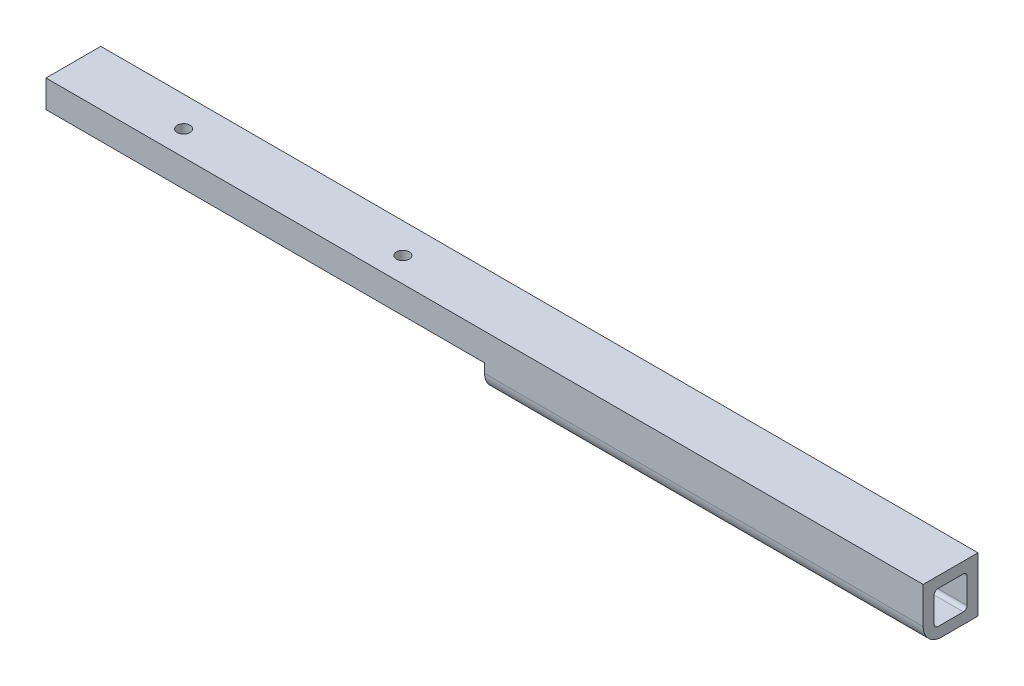
ISO-10303-21;
HEADER;
FILE_DESCRIPTION(('STEP AP214'),'2;1');
FILE_NAME('part.step','',(''),(''),'','','');
FILE_SCHEMA(('AUTOMOTIVE_DESIGN { 1 0 10303 214 1 1 1 1 }'));
ENDSEC;
DATA;
#1=APPLICATION_CONTEXT('core data for automotive mechanical design processes');
#2=APPLICATION_PROTOCOL_DEFINITION('international standard','automotive_design',2000,#1);
#3=PRODUCT_CONTEXT('',#1,'mechanical');
#4=PRODUCT('Part','Part','',(#3));
#5=PRODUCT_RELATED_PRODUCT_CATEGORY('part','',(#4));
#6=PRODUCT_DEFINITION_FORMATION('','',#4);
#7=PRODUCT_DEFINITION_CONTEXT('part definition',#1,'design');
#8=PRODUCT_DEFINITION('design','',#6,#7);
#9=PRODUCT_DEFINITION_SHAPE('','',#8);
#10=(LENGTH_UNIT() NAMED_UNIT(*) SI_UNIT(.MILLI.,.METRE.));
#11=(NAMED_UNIT(*) PLANE_ANGLE_UNIT() SI_UNIT($,.RADIAN.));
#12=(NAMED_UNIT(*) SI_UNIT($,.STERADIAN.) SOLID_ANGLE_UNIT());
#13=UNCERTAINTY_MEASURE_WITH_UNIT(LENGTH_MEASURE(1.E-05),#10,'distance_accuracy_value','');
#14=(GEOMETRIC_REPRESENTATION_CONTEXT(3) GLOBAL_UNCERTAINTY_ASSIGNED_CONTEXT((#13)) GLOBAL_UNIT_ASSIGNED_CONTEXT((#10,
#11,#12)) REPRESENTATION_CONTEXT('',''));
#15=CARTESIAN_POINT('',(0.,0.,0.));
#16=DIRECTION('',(0.,0.,1.));
#17=DIRECTION('',(1.,0.,0.));
#18=AXIS2_PLACEMENT_3D('',#15,#16,#17);
#19=CARTESIAN_POINT('',(225.,-320.691488077077,22.39));
#20=DIRECTION('',(-1.,0.,0.));
#21=DIRECTION('',(0.,0.,1.));
#22=AXIS2_PLACEMENT_3D('',#19,#20,#21);
#23=PLANE('',#22);
#24=DIRECTION('',(0.,0.,1.));
#25=VECTOR('',#24,1.);
#26=CARTESIAN_POINT('',(225.,-320.691488077077,22.39));
#27=LINE('',#26,#25);
#28=CARTESIAN_POINT('',(225.,-320.691488077077,22.4));
#29=VERTEX_POINT('',#28);
#30=CARTESIAN_POINT('',(225.,-320.691488077077,37.4));
#31=VERTEX_POINT('',#30);
#32=EDGE_CURVE('E11',#29,#31,#27,.T.);
#33=ORIENTED_EDGE('',*,*,#32,.F.);
#34=DIRECTION('',(0.,-1.,0.));
#35=VECTOR('',#34,1.);
#36=CARTESIAN_POINT('',(225.,-313.191488077077,22.4));
#37=LINE('',#36,#35);
#38=CARTESIAN_POINT('',(225.,-328.191488077078,22.4));
#39=VERTEX_POINT('',#38);
#40=EDGE_CURVE('E221',#29,#39,#37,.T.);
#41=ORIENTED_EDGE('',*,*,#40,.T.);
#42=DIRECTION('',(0.,0.,1.));
#43=VECTOR('',#42,1.);
#44=CARTESIAN_POINT('',(225.,-328.191488077078,22.4));
#45=LINE('',#44,#43);
#46=CARTESIAN_POINT('',(225.,-328.191488077077,32.4));
#47=VERTEX_POINT('',#46);
#48=EDGE_CURVE('E193',#39,#47,#45,.T.);
#49=ORIENTED_EDGE('',*,*,#48,.T.);
#50=CARTESIAN_POINT('',(225.,-323.191488077077,32.4));
#51=DIRECTION('',(-1.,0.,0.));
#52=DIRECTION('',(0.,0.,1.));
#53=AXIS2_PLACEMENT_3D('',#50,#51,#52);
#54=CIRCLE('',#53,5.);
#55=CARTESIAN_POINT('',(225.,-323.191488077077,37.4));
#56=VERTEX_POINT('',#55);
#57=EDGE_CURVE('E188',#56,#47,#54,.F.);
#58=ORIENTED_EDGE('',*,*,#57,.F.);
#59=DIRECTION('',(0.,1.,0.));
#60=VECTOR('',#59,1.);
#61=CARTESIAN_POINT('',(225.,-313.191488077077,37.4));
#62=LINE('',#61,#60);
#63=EDGE_CURVE('E205',#56,#31,#62,.T.);
#64=ORIENTED_EDGE('',*,*,#63,.T.);
#65=EDGE_LOOP('',(#33,#41,#49,#58,#64));
#66=FACE_BOUND('',#65,.T.);
#67=ADVANCED_FACE('F37',(#66),#23,.T.);
#68=CARTESIAN_POINT('',(105.,-320.691488077077,22.39));
#69=DIRECTION('',(0.,-1.,0.));
#70=DIRECTION('',(0.,0.,-1.));
#71=AXIS2_PLACEMENT_3D('',#68,#69,#70);
#72=PLANE('',#71);
#73=CARTESIAN_POINT('',(195.886266753297,-320.691488077077,30.6295855642618));
#74=DIRECTION('',(0.,-1.,0.));
#75=DIRECTION('',(0.,0.,-1.));
#76=AXIS2_PLACEMENT_3D('',#73,#74,#75);
#77=CIRCLE('',#76,1.75000000000001);
#78=CARTESIAN_POINT('',(195.886266753297,-320.691488077077,28.8795855642618));
#79=VERTEX_POINT('',#78);
#80=EDGE_CURVE('E250',#79,#79,#77,.T.);
#81=ORIENTED_EDGE('',*,*,#80,.F.);
#82=EDGE_LOOP('',(#81));
#83=FACE_BOUND('',#82,.T.);
#84=CARTESIAN_POINT('',(135.886266753297,-320.691488077077,30.6295855642618));
#85=DIRECTION('',(0.,-1.,0.));
#86=DIRECTION('',(0.,0.,-1.));
#87=AXIS2_PLACEMENT_3D('',#84,#85,#86);
#88=CIRCLE('',#87,1.75000000000001);
#89=CARTESIAN_POINT('',(135.886266753297,-320.691488077077,28.8795855642618));
#90=VERTEX_POINT('',#89);
#91=EDGE_CURVE('E225',#90,#90,#88,.T.);
#92=ORIENTED_EDGE('',*,*,#91,.F.);
#93=EDGE_LOOP('',(#92));
#94=FACE_BOUND('',#93,.T.);
#95=DIRECTION('',(0.,0.,1.));
#96=VECTOR('',#95,1.);
#97=CARTESIAN_POINT('',(105.,-320.691488077077,22.39));
#98=LINE('',#97,#96);
#99=CARTESIAN_POINT('',(105.,-320.691488077077,22.4));
#100=VERTEX_POINT('',#99);
#101=CARTESIAN_POINT('',(105.,-320.691488077077,37.4));
#102=VERTEX_POINT('',#101);
#103=EDGE_CURVE('E48',#100,#102,#98,.T.);
#104=ORIENTED_EDGE('',*,*,#103,.F.);
#105=DIRECTION('',(1.,0.,0.));
#106=VECTOR('',#105,1.);
#107=CARTESIAN_POINT('',(366.213203435596,-320.691488077077,22.4));
#108=LINE('',#107,#106);
#109=EDGE_CURVE('E217',#100,#29,#108,.T.);
#110=ORIENTED_EDGE('',*,*,#109,.T.);
#111=ORIENTED_EDGE('',*,*,#32,.T.);
#112=DIRECTION('',(-1.,0.,0.));
#113=VECTOR('',#112,1.);
#114=CARTESIAN_POINT('',(366.213203435596,-320.691488077077,37.4));
#115=LINE('',#114,#113);
#116=EDGE_CURVE('E201',#31,#102,#115,.T.);
#117=ORIENTED_EDGE('',*,*,#116,.T.);
#118=EDGE_LOOP('',(#104,#110,#111,#117));
#119=FACE_BOUND('',#118,.T.);
#120=ADVANCED_FACE('F334',(#83,#94,#119),#72,.T.);
#121=CARTESIAN_POINT('',(105.,-313.191488077077,22.39));
#122=DIRECTION('',(-1.,0.,0.));
#123=DIRECTION('',(0.,-1.,0.));
#124=AXIS2_PLACEMENT_3D('',#121,#122,#123);
#125=PLANE('',#124);
#126=DIRECTION('',(0.,0.,-1.));
#127=VECTOR('',#126,1.);
#128=CARTESIAN_POINT('',(105.,-313.191488077077,22.4));
#129=LINE('',#128,#127);
#130=CARTESIAN_POINT('',(105.,-313.191488077077,37.4));
#131=VERTEX_POINT('',#130);
#132=CARTESIAN_POINT('',(105.,-313.191488077077,22.4));
#133=VERTEX_POINT('',#132);
#134=EDGE_CURVE('E209',#131,#133,#129,.T.);
#135=ORIENTED_EDGE('',*,*,#134,.T.);
#136=DIRECTION('',(0.,-1.,0.));
#137=VECTOR('',#136,1.);
#138=CARTESIAN_POINT('',(105.,-313.191488077078,22.4));
#139=LINE('',#138,#137);
#140=EDGE_CURVE('E213',#133,#100,#139,.T.);
#141=ORIENTED_EDGE('',*,*,#140,.T.);
#142=ORIENTED_EDGE('',*,*,#103,.T.);
#143=DIRECTION('',(0.,1.,0.));
#144=VECTOR('',#143,1.);
#145=CARTESIAN_POINT('',(105.,-313.191488077078,37.4));
#146=LINE('',#145,#144);
#147=EDGE_CURVE('E197',#102,#131,#146,.T.);
#148=ORIENTED_EDGE('',*,*,#147,.T.);
#149=EDGE_LOOP('',(#135,#141,#142,#148));
#150=FACE_BOUND('',#149,.T.);
#151=ADVANCED_FACE('F327',(#150),#125,.T.);
#152=CARTESIAN_POINT('',(335.,-324.191488077078,26.4));
#153=DIRECTION('',(1.,0.,0.));
#154=DIRECTION('',(0.,0.,-1.));
#155=AXIS2_PLACEMENT_3D('',#152,#153,#154);
#156=PLANE('',#155);
#157=CARTESIAN_POINT('',(335.,-324.191488077078,26.4));
#158=DIRECTION('',(1.,0.,0.));
#159=DIRECTION('',(0.,0.,-1.));
#160=AXIS2_PLACEMENT_3D('',#157,#158,#159);
#161=CIRCLE('',#160,1.);
#162=CARTESIAN_POINT('',(335.,-325.191488077078,26.4));
#163=VERTEX_POINT('',#162);
#164=CARTESIAN_POINT('',(335.,-324.191488077078,25.4));
#165=VERTEX_POINT('',#164);
#166=EDGE_CURVE('E180',#163,#165,#161,.T.);
#167=ORIENTED_EDGE('',*,*,#166,.T.);
#168=DIRECTION('',(0.,1.,0.));
#169=VECTOR('',#168,1.);
#170=CARTESIAN_POINT('',(335.,-324.191488077078,25.4));
#171=LINE('',#170,#169);
#172=CARTESIAN_POINT('',(335.,-317.191488077077,25.4));
#173=VERTEX_POINT('',#172);
#174=EDGE_CURVE('E176',#165,#173,#171,.T.);
#175=ORIENTED_EDGE('',*,*,#174,.T.);
#176=CARTESIAN_POINT('',(335.,-317.191488077077,26.4));
#177=DIRECTION('',(1.,0.,0.));
#178=DIRECTION('',(0.,0.,-1.));
#179=AXIS2_PLACEMENT_3D('',#176,#177,#178);
#180=CIRCLE('',#179,1.);
#181=CARTESIAN_POINT('',(335.,-316.191488077077,26.4));
#182=VERTEX_POINT('',#181);
#183=EDGE_CURVE('E172',#173,#182,#180,.T.);
#184=ORIENTED_EDGE('',*,*,#183,.T.);
#185=DIRECTION('',(0.,0.,1.));
#186=VECTOR('',#185,1.);
#187=CARTESIAN_POINT('',(335.,-316.191488077077,26.4));
#188=LINE('',#187,#186);
#189=CARTESIAN_POINT('',(335.,-316.191488077077,33.4));
#190=VERTEX_POINT('',#189);
#191=EDGE_CURVE('E169',#182,#190,#188,.T.);
#192=ORIENTED_EDGE('',*,*,#191,.T.);
#193=CARTESIAN_POINT('',(335.,-317.191488077077,33.4));
#194=DIRECTION('',(1.,0.,0.));
#195=DIRECTION('',(0.,0.,1.));
#196=AXIS2_PLACEMENT_3D('',#193,#194,#195);
#197=CIRCLE('',#196,1.);
#198=CARTESIAN_POINT('',(335.,-317.191488077077,34.4));
#199=VERTEX_POINT('',#198);
#200=EDGE_CURVE('E119',#190,#199,#197,.T.);
#201=ORIENTED_EDGE('',*,*,#200,.T.);
#202=DIRECTION('',(0.,-1.,0.));
#203=VECTOR('',#202,1.);
#204=CARTESIAN_POINT('',(335.,-317.191488077077,34.4));
#205=LINE('',#204,#203);
#206=CARTESIAN_POINT('',(335.,-324.191488077077,34.4));
#207=VERTEX_POINT('',#206);
#208=EDGE_CURVE('E164',#199,#207,#205,.T.);
#209=ORIENTED_EDGE('',*,*,#208,.T.);
#210=CARTESIAN_POINT('',(335.,-324.191488077077,33.4));
#211=DIRECTION('',(1.,0.,0.));
#212=DIRECTION('',(0.,0.,-1.));
#213=AXIS2_PLACEMENT_3D('',#210,#211,#212);
#214=CIRCLE('',#213,1.);
#215=CARTESIAN_POINT('',(335.,-325.191488077077,33.4));
#216=VERTEX_POINT('',#215);
#217=EDGE_CURVE('E160',#207,#216,#214,.T.);
#218=ORIENTED_EDGE('',*,*,#217,.T.);
#219=DIRECTION('',(0.,0.,-1.));
#220=VECTOR('',#219,1.);
#221=CARTESIAN_POINT('',(335.,-325.191488077077,33.4));
#222=LINE('',#221,#220);
#223=EDGE_CURVE('E157',#216,#163,#222,.T.);
#224=ORIENTED_EDGE('',*,*,#223,.T.);
#225=EDGE_LOOP('',(#167,#175,#184,#192,#201,#209,#218,#224));
#226=FACE_BOUND('',#225,.T.);
#227=ADVANCED_FACE('F313',(#226),#156,.T.);
#228=CARTESIAN_POINT('',(335.,-317.191488077077,26.4));
#229=DIRECTION('',(1.,0.,0.));
#230=DIRECTION('',(0.,0.,-1.));
#231=AXIS2_PLACEMENT_3D('',#228,#229,#230);
#232=CYLINDRICAL_SURFACE('',#231,1.);
#233=CARTESIAN_POINT('',(345.,-317.191488077077,26.4));
#234=DIRECTION('',(1.,0.,0.));
#235=DIRECTION('',(0.,0.,-1.));
#236=AXIS2_PLACEMENT_3D('',#233,#234,#235);
#237=CIRCLE('',#236,1.);
#238=CARTESIAN_POINT('',(345.,-317.191488077077,25.4));
#239=VERTEX_POINT('',#238);
#240=CARTESIAN_POINT('',(345.,-316.191488077077,26.4));
#241=VERTEX_POINT('',#240);
#242=EDGE_CURVE('E133',#239,#241,#237,.T.);
#243=ORIENTED_EDGE('',*,*,#242,.T.);
#244=DIRECTION('',(1.,0.,0.));
#245=VECTOR('',#244,1.);
#246=CARTESIAN_POINT('',(335.,-316.191488077077,26.4));
#247=LINE('',#246,#245);
#248=EDGE_CURVE('E124',#182,#241,#247,.T.);
#249=ORIENTED_EDGE('',*,*,#248,.F.);
#250=ORIENTED_EDGE('',*,*,#183,.F.);
#251=DIRECTION('',(1.,0.,0.));
#252=VECTOR('',#251,1.);
#253=CARTESIAN_POINT('',(335.,-317.191488077077,25.4));
#254=LINE('',#253,#252);
#255=EDGE_CURVE('E57',#173,#239,#254,.T.);
#256=ORIENTED_EDGE('',*,*,#255,.T.);
#257=EDGE_LOOP('',(#243,#249,#250,#256));
#258=FACE_BOUND('',#257,.T.);
#259=ADVANCED_FACE('F326',(#258),#232,.F.);
#260=CARTESIAN_POINT('',(335.,-316.191488077077,26.4));
#261=DIRECTION('',(0.,1.,0.));
#262=DIRECTION('',(0.,0.,1.));
#263=AXIS2_PLACEMENT_3D('',#260,#261,#262);
#264=PLANE('',#263);
#265=DIRECTION('',(0.,0.,1.));
#266=VECTOR('',#265,1.);
#267=CARTESIAN_POINT('',(345.,-316.191488077077,26.4));
#268=LINE('',#267,#266);
#269=CARTESIAN_POINT('',(345.,-316.191488077077,33.4));
#270=VERTEX_POINT('',#269);
#271=EDGE_CURVE('E128',#241,#270,#268,.T.);
#272=ORIENTED_EDGE('',*,*,#271,.T.);
#273=DIRECTION('',(1.,0.,0.));
#274=VECTOR('',#273,1.);
#275=CARTESIAN_POINT('',(335.,-316.191488077077,33.4));
#276=LINE('',#275,#274);
#277=EDGE_CURVE('E112',#190,#270,#276,.T.);
#278=ORIENTED_EDGE('',*,*,#277,.F.);
#279=ORIENTED_EDGE('',*,*,#191,.F.);
#280=ORIENTED_EDGE('',*,*,#248,.T.);
#281=EDGE_LOOP('',(#272,#278,#279,#280));
#282=FACE_BOUND('',#281,.T.);
#283=ADVANCED_FACE('F129',(#282),#264,.F.);
#284=CARTESIAN_POINT('',(335.,-317.191488077077,33.4));
#285=DIRECTION('',(1.,0.,0.));
#286=DIRECTION('',(0.,0.,-1.));
#287=AXIS2_PLACEMENT_3D('',#284,#285,#286);
#288=CYLINDRICAL_SURFACE('',#287,1.);
#289=CARTESIAN_POINT('',(345.,-317.191488077077,33.4));
#290=DIRECTION('',(1.,0.,0.));
#291=DIRECTION('',(0.,0.,1.));
#292=AXIS2_PLACEMENT_3D('',#289,#290,#291);
#293=CIRCLE('',#292,1.);
#294=CARTESIAN_POINT('',(345.,-317.191488077077,34.4));
#295=VERTEX_POINT('',#294);
#296=EDGE_CURVE('E116',#270,#295,#293,.T.);
#297=ORIENTED_EDGE('',*,*,#296,.T.);
#298=DIRECTION('',(1.,0.,0.));
#299=VECTOR('',#298,1.);
#300=CARTESIAN_POINT('',(335.,-317.191488077077,34.4));
#301=LINE('',#300,#299);
#302=EDGE_CURVE('E125',#199,#295,#301,.T.);
#303=ORIENTED_EDGE('',*,*,#302,.F.);
#304=ORIENTED_EDGE('',*,*,#200,.F.);
#305=ORIENTED_EDGE('',*,*,#277,.T.);
#306=EDGE_LOOP('',(#297,#303,#304,#305));
#307=FACE_BOUND('',#306,.T.);
#308=ADVANCED_FACE('F114',(#307),#288,.F.);
#309=CARTESIAN_POINT('',(335.,-323.191488077077,34.4));
#310=DIRECTION('',(0.,0.,1.));
#311=DIRECTION('',(1.,0.,0.));
#312=AXIS2_PLACEMENT_3D('',#309,#310,#311);
#313=PLANE('',#312);
#314=DIRECTION('',(0.,-1.,0.));
#315=VECTOR('',#314,1.);
#316=CARTESIAN_POINT('',(345.,-323.191488077077,34.4));
#317=LINE('',#316,#315);
#318=CARTESIAN_POINT('',(345.,-324.191488077077,34.4));
#319=VERTEX_POINT('',#318);
#320=EDGE_CURVE('E140',#295,#319,#317,.T.);
#321=ORIENTED_EDGE('',*,*,#320,.T.);
#322=DIRECTION('',(1.,0.,0.));
#323=VECTOR('',#322,1.);
#324=CARTESIAN_POINT('',(335.,-324.191488077077,34.4));
#325=LINE('',#324,#323);
#326=EDGE_CURVE('E291',#207,#319,#325,.T.);
#327=ORIENTED_EDGE('',*,*,#326,.F.);
#328=ORIENTED_EDGE('',*,*,#208,.F.);
#329=ORIENTED_EDGE('',*,*,#302,.T.);
#330=EDGE_LOOP('',(#321,#327,#328,#329));
#331=FACE_BOUND('',#330,.T.);
#332=ADVANCED_FACE('F316',(#331),#313,.F.);
#333=CARTESIAN_POINT('',(335.,-324.191488077077,33.4));
#334=DIRECTION('',(1.,0.,0.));
#335=DIRECTION('',(0.,0.,-1.));
#336=AXIS2_PLACEMENT_3D('',#333,#334,#335);
#337=CYLINDRICAL_SURFACE('',#336,1.);
#338=CARTESIAN_POINT('',(345.,-324.191488077077,33.4));
#339=DIRECTION('',(1.,0.,0.));
#340=DIRECTION('',(0.,0.,-1.));
#341=AXIS2_PLACEMENT_3D('',#338,#339,#340);
#342=CIRCLE('',#341,1.);
#343=CARTESIAN_POINT('',(345.,-325.191488077077,33.4));
#344=VERTEX_POINT('',#343);
#345=EDGE_CURVE('E145',#319,#344,#342,.T.);
#346=ORIENTED_EDGE('',*,*,#345,.T.);
#347=DIRECTION('',(1.,0.,0.));
#348=VECTOR('',#347,1.);
#349=CARTESIAN_POINT('',(335.,-325.191488077077,33.4));
#350=LINE('',#349,#348);
#351=EDGE_CURVE('E294',#216,#344,#350,.T.);
#352=ORIENTED_EDGE('',*,*,#351,.F.);
#353=ORIENTED_EDGE('',*,*,#217,.F.);
#354=ORIENTED_EDGE('',*,*,#326,.T.);
#355=EDGE_LOOP('',(#346,#352,#353,#354));
#356=FACE_BOUND('',#355,.T.);
#357=ADVANCED_FACE('F305',(#356),#337,.F.);
#358=CARTESIAN_POINT('',(335.,-325.191488077077,32.4));
#359=DIRECTION('',(0.,-1.,0.));
#360=DIRECTION('',(0.,0.,-1.));
#361=AXIS2_PLACEMENT_3D('',#358,#359,#360);
#362=PLANE('',#361);
#363=DIRECTION('',(0.,0.,-1.));
#364=VECTOR('',#363,1.);
#365=CARTESIAN_POINT('',(345.,-325.191488077077,32.4));
#366=LINE('',#365,#364);
#367=CARTESIAN_POINT('',(345.,-325.191488077078,26.4));
#368=VERTEX_POINT('',#367);
#369=EDGE_CURVE('E183',#344,#368,#366,.T.);
#370=ORIENTED_EDGE('',*,*,#369,.T.);
#371=DIRECTION('',(1.,0.,0.));
#372=VECTOR('',#371,1.);
#373=CARTESIAN_POINT('',(335.,-325.191488077078,26.4));
#374=LINE('',#373,#372);
#375=EDGE_CURVE('E96',#163,#368,#374,.T.);
#376=ORIENTED_EDGE('',*,*,#375,.F.);
#377=ORIENTED_EDGE('',*,*,#223,.F.);
#378=ORIENTED_EDGE('',*,*,#351,.T.);
#379=EDGE_LOOP('',(#370,#376,#377,#378));
#380=FACE_BOUND('',#379,.T.);
#381=ADVANCED_FACE('F311',(#380),#362,.F.);
#382=CARTESIAN_POINT('',(335.,-324.191488077078,26.4));
#383=DIRECTION('',(1.,0.,0.));
#384=DIRECTION('',(0.,0.,-1.));
#385=AXIS2_PLACEMENT_3D('',#382,#383,#384);
#386=CYLINDRICAL_SURFACE('',#385,1.);
#387=CARTESIAN_POINT('',(345.,-324.191488077078,26.4));
#388=DIRECTION('',(1.,0.,0.));
#389=DIRECTION('',(0.,0.,-1.));
#390=AXIS2_PLACEMENT_3D('',#387,#388,#389);
#391=CIRCLE('',#390,1.);
#392=CARTESIAN_POINT('',(345.,-324.191488077077,25.4));
#393=VERTEX_POINT('',#392);
#394=EDGE_CURVE('E154',#368,#393,#391,.T.);
#395=ORIENTED_EDGE('',*,*,#394,.T.);
#396=DIRECTION('',(1.,0.,0.));
#397=VECTOR('',#396,1.);
#398=CARTESIAN_POINT('',(335.,-324.191488077078,25.4));
#399=LINE('',#398,#397);
#400=EDGE_CURVE('E91',#165,#393,#399,.T.);
#401=ORIENTED_EDGE('',*,*,#400,.F.);
#402=ORIENTED_EDGE('',*,*,#166,.F.);
#403=ORIENTED_EDGE('',*,*,#375,.T.);
#404=EDGE_LOOP('',(#395,#401,#402,#403));
#405=FACE_BOUND('',#404,.T.);
#406=ADVANCED_FACE('F474',(#405),#386,.F.);
#407=CARTESIAN_POINT('',(335.,-324.191488077078,25.4));
#408=DIRECTION('',(0.,0.,-1.));
#409=DIRECTION('',(0.,1.,0.));
#410=AXIS2_PLACEMENT_3D('',#407,#408,#409);
#411=PLANE('',#410);
#412=DIRECTION('',(0.,1.,0.));
#413=VECTOR('',#412,1.);
#414=CARTESIAN_POINT('',(345.,-324.191488077078,25.4));
#415=LINE('',#414,#413);
#416=EDGE_CURVE('E151',#393,#239,#415,.T.);
#417=ORIENTED_EDGE('',*,*,#416,.T.);
#418=ORIENTED_EDGE('',*,*,#255,.F.);
#419=ORIENTED_EDGE('',*,*,#174,.F.);
#420=ORIENTED_EDGE('',*,*,#400,.T.);
#421=EDGE_LOOP('',(#417,#418,#419,#420));
#422=FACE_BOUND('',#421,.T.);
#423=ADVANCED_FACE('F485',(#422),#411,.F.);
#424=CARTESIAN_POINT('',(345.,-349.404691512674,22.4));
#425=DIRECTION('',(-1.,0.,0.));
#426=DIRECTION('',(0.,0.,1.));
#427=AXIS2_PLACEMENT_3D('',#424,#425,#426);
#428=PLANE('',#427);
#429=ORIENTED_EDGE('',*,*,#416,.F.);
#430=ORIENTED_EDGE('',*,*,#394,.F.);
#431=ORIENTED_EDGE('',*,*,#369,.F.);
#432=ORIENTED_EDGE('',*,*,#345,.F.);
#433=ORIENTED_EDGE('',*,*,#320,.F.);
#434=ORIENTED_EDGE('',*,*,#296,.F.);
#435=ORIENTED_EDGE('',*,*,#271,.F.);
#436=ORIENTED_EDGE('',*,*,#242,.F.);
#437=EDGE_LOOP('',(#429,#430,#431,#432,#433,#434,#435,#436));
#438=FACE_BOUND('',#437,.T.);
#439=DIRECTION('',(0.,1.,0.));
#440=VECTOR('',#439,1.);
#441=CARTESIAN_POINT('',(345.,-313.191488077077,37.4));
#442=LINE('',#441,#440);
#443=CARTESIAN_POINT('',(345.,-323.191488077077,37.4));
#444=VERTEX_POINT('',#443);
#445=CARTESIAN_POINT('',(345.,-313.191488077077,37.4));
#446=VERTEX_POINT('',#445);
#447=EDGE_CURVE('E272',#444,#446,#442,.T.);
#448=ORIENTED_EDGE('',*,*,#447,.F.);
#449=CARTESIAN_POINT('',(345.,-323.191488077077,32.4));
#450=DIRECTION('',(-1.,0.,0.));
#451=DIRECTION('',(0.,0.,1.));
#452=AXIS2_PLACEMENT_3D('',#449,#450,#451);
#453=CIRCLE('',#452,5.);
#454=CARTESIAN_POINT('',(345.,-328.191488077077,32.4));
#455=VERTEX_POINT('',#454);
#456=EDGE_CURVE('E192',#444,#455,#453,.F.);
#457=ORIENTED_EDGE('',*,*,#456,.T.);
#458=DIRECTION('',(0.,0.,1.));
#459=VECTOR('',#458,1.);
#460=CARTESIAN_POINT('',(345.,-328.191488077078,22.4));
#461=LINE('',#460,#459);
#462=CARTESIAN_POINT('',(345.,-328.191488077078,22.4));
#463=VERTEX_POINT('',#462);
#464=EDGE_CURVE('E240',#463,#455,#461,.T.);
#465=ORIENTED_EDGE('',*,*,#464,.F.);
#466=DIRECTION('',(0.,-1.,0.));
#467=VECTOR('',#466,1.);
#468=CARTESIAN_POINT('',(345.,-313.191488077077,22.4));
#469=LINE('',#468,#467);
#470=CARTESIAN_POINT('',(345.,-313.191488077077,22.4));
#471=VERTEX_POINT('',#470);
#472=EDGE_CURVE('E234',#471,#463,#469,.T.);
#473=ORIENTED_EDGE('',*,*,#472,.F.);
#474=DIRECTION('',(0.,0.,-1.));
#475=VECTOR('',#474,1.);
#476=CARTESIAN_POINT('',(345.,-313.191488077077,22.4));
#477=LINE('',#476,#475);
#478=EDGE_CURVE('E276',#446,#471,#477,.T.);
#479=ORIENTED_EDGE('',*,*,#478,.F.);
#480=EDGE_LOOP('',(#448,#457,#465,#473,#479));
#481=FACE_BOUND('',#480,.T.);
#482=ADVANCED_FACE('F136',(#438,#481),#428,.F.);
#483=CARTESIAN_POINT('',(366.213203435596,-328.191488077078,22.4));
#484=DIRECTION('',(0.,1.,0.));
#485=DIRECTION('',(0.,0.,1.));
#486=AXIS2_PLACEMENT_3D('',#483,#484,#485);
#487=PLANE('',#486);
#488=ORIENTED_EDGE('',*,*,#48,.F.);
#489=DIRECTION('',(-1.,0.,0.));
#490=VECTOR('',#489,1.);
#491=CARTESIAN_POINT('',(366.213203435596,-328.191488077078,22.4));
#492=LINE('',#491,#490);
#493=EDGE_CURVE('E244',#463,#39,#492,.T.);
#494=ORIENTED_EDGE('',*,*,#493,.F.);
#495=ORIENTED_EDGE('',*,*,#464,.T.);
#496=DIRECTION('',(-1.,0.,0.));
#497=VECTOR('',#496,1.);
#498=CARTESIAN_POINT('',(366.213203435596,-328.191488077077,32.4));
#499=LINE('',#498,#497);
#500=EDGE_CURVE('E230',#455,#47,#499,.T.);
#501=ORIENTED_EDGE('',*,*,#500,.T.);
#502=EDGE_LOOP('',(#488,#494,#495,#501));
#503=FACE_BOUND('',#502,.T.);
#504=ADVANCED_FACE('F347',(#503),#487,.F.);
#505=CARTESIAN_POINT('',(366.213203435596,-313.191488077077,37.4));
#506=DIRECTION('',(0.,0.,-1.));
#507=DIRECTION('',(0.,1.,0.));
#508=AXIS2_PLACEMENT_3D('',#505,#506,#507);
#509=PLANE('',#508);
#510=ORIENTED_EDGE('',*,*,#147,.F.);
#511=ORIENTED_EDGE('',*,*,#116,.F.);
#512=ORIENTED_EDGE('',*,*,#63,.F.);
#513=DIRECTION('',(-1.,0.,0.));
#514=VECTOR('',#513,1.);
#515=CARTESIAN_POINT('',(366.213203435596,-323.191488077077,37.4));
#516=LINE('',#515,#514);
#517=EDGE_CURVE('E226',#56,#444,#516,.F.);
#518=ORIENTED_EDGE('',*,*,#517,.T.);
#519=ORIENTED_EDGE('',*,*,#447,.T.);
#520=DIRECTION('',(-1.,0.,0.));
#521=VECTOR('',#520,1.);
#522=CARTESIAN_POINT('',(366.213203435596,-313.191488077077,37.4));
#523=LINE('',#522,#521);
#524=EDGE_CURVE('E239',#446,#131,#523,.T.);
#525=ORIENTED_EDGE('',*,*,#524,.T.);
#526=EDGE_LOOP('',(#510,#511,#512,#518,#519,#525));
#527=FACE_BOUND('',#526,.T.);
#528=ADVANCED_FACE('F350',(#527),#509,.F.);
#529=CARTESIAN_POINT('',(366.213203435596,-323.191488077077,32.4));
#530=DIRECTION('',(-1.,0.,0.));
#531=DIRECTION('',(0.,0.,1.));
#532=AXIS2_PLACEMENT_3D('',#529,#530,#531);
#533=CYLINDRICAL_SURFACE('',#532,5.);
#534=ORIENTED_EDGE('',*,*,#517,.F.);
#535=ORIENTED_EDGE('',*,*,#57,.T.);
#536=ORIENTED_EDGE('',*,*,#500,.F.);
#537=ORIENTED_EDGE('',*,*,#456,.F.);
#538=EDGE_LOOP('',(#534,#535,#536,#537));
#539=FACE_BOUND('',#538,.T.);
#540=ADVANCED_FACE('F39',(#539),#533,.T.);
#541=CARTESIAN_POINT('',(366.213203435596,-313.191488077077,22.4));
#542=DIRECTION('',(0.,-1.,0.));
#543=DIRECTION('',(0.,0.,-1.));
#544=AXIS2_PLACEMENT_3D('',#541,#542,#543);
#545=PLANE('',#544);
#546=CARTESIAN_POINT('',(195.886266753297,-313.191488077077,30.6295855642618));
#547=DIRECTION('',(0.,-1.,0.));
#548=DIRECTION('',(0.,0.,-1.));
#549=AXIS2_PLACEMENT_3D('',#546,#547,#548);
#550=CIRCLE('',#549,1.75000000000001);
#551=CARTESIAN_POINT('',(195.886266753297,-313.191488077077,28.8795855642618));
#552=VERTEX_POINT('',#551);
#553=EDGE_CURVE('E41',#552,#552,#550,.T.);
#554=ORIENTED_EDGE('',*,*,#553,.T.);
#555=EDGE_LOOP('',(#554));
#556=FACE_BOUND('',#555,.T.);
#557=CARTESIAN_POINT('',(135.886266753297,-313.191488077077,30.6295855642618));
#558=DIRECTION('',(0.,-1.,0.));
#559=DIRECTION('',(0.,0.,-1.));
#560=AXIS2_PLACEMENT_3D('',#557,#558,#559);
#561=CIRCLE('',#560,1.75000000000001);
#562=CARTESIAN_POINT('',(135.886266753297,-313.191488077077,28.8795855642618));
#563=VERTEX_POINT('',#562);
#564=EDGE_CURVE('E247',#563,#563,#561,.T.);
#565=ORIENTED_EDGE('',*,*,#564,.T.);
#566=EDGE_LOOP('',(#565));
#567=FACE_BOUND('',#566,.T.);
#568=ORIENTED_EDGE('',*,*,#134,.F.);
#569=ORIENTED_EDGE('',*,*,#524,.F.);
#570=ORIENTED_EDGE('',*,*,#478,.T.);
#571=DIRECTION('',(-1.,0.,0.));
#572=VECTOR('',#571,1.);
#573=CARTESIAN_POINT('',(366.213203435596,-313.191488077077,22.4));
#574=LINE('',#573,#572);
#575=EDGE_CURVE('E235',#471,#133,#574,.T.);
#576=ORIENTED_EDGE('',*,*,#575,.T.);
#577=EDGE_LOOP('',(#568,#569,#570,#576));
#578=FACE_BOUND('',#577,.T.);
#579=ADVANCED_FACE('F355',(#556,#567,#578),#545,.F.);
#580=CARTESIAN_POINT('',(366.213203435596,-313.191488077077,22.4));
#581=DIRECTION('',(0.,0.,1.));
#582=DIRECTION('',(0.,-1.,0.));
#583=AXIS2_PLACEMENT_3D('',#580,#581,#582);
#584=PLANE('',#583);
#585=ORIENTED_EDGE('',*,*,#140,.F.);
#586=ORIENTED_EDGE('',*,*,#575,.F.);
#587=ORIENTED_EDGE('',*,*,#472,.T.);
#588=ORIENTED_EDGE('',*,*,#493,.T.);
#589=ORIENTED_EDGE('',*,*,#40,.F.);
#590=ORIENTED_EDGE('',*,*,#109,.F.);
#591=EDGE_LOOP('',(#585,#586,#587,#588,#589,#590));
#592=FACE_BOUND('',#591,.T.);
#593=ADVANCED_FACE('F346',(#592),#584,.F.);
#594=CARTESIAN_POINT('',(135.886266753297,-328.191488077078,30.6295855642618));
#595=DIRECTION('',(0.,1.,0.));
#596=DIRECTION('',(0.,0.,1.));
#597=AXIS2_PLACEMENT_3D('',#594,#595,#596);
#598=CYLINDRICAL_SURFACE('',#597,1.75000000000001);
#599=ORIENTED_EDGE('',*,*,#91,.T.);
#600=EDGE_LOOP('',(#599));
#601=FACE_BOUND('',#600,.T.);
#602=ORIENTED_EDGE('',*,*,#564,.F.);
#603=EDGE_LOOP('',(#602));
#604=FACE_BOUND('',#603,.T.);
#605=ADVANCED_FACE('F341',(#601,#604),#598,.F.);
#606=CARTESIAN_POINT('',(195.886266753297,-328.191488077078,30.6295855642618));
#607=DIRECTION('',(0.,1.,0.));
#608=DIRECTION('',(0.,0.,1.));
#609=AXIS2_PLACEMENT_3D('',#606,#607,#608);
#610=CYLINDRICAL_SURFACE('',#609,1.75000000000001);
#611=ORIENTED_EDGE('',*,*,#80,.T.);
#612=EDGE_LOOP('',(#611));
#613=FACE_BOUND('',#612,.T.);
#614=ORIENTED_EDGE('',*,*,#553,.F.);
#615=EDGE_LOOP('',(#614));
#616=FACE_BOUND('',#615,.T.);
#617=ADVANCED_FACE('F363',(#613,#616),#610,.F.);
#618=CLOSED_SHELL('',(#67,#120,#151,#227,#259,#283,#308,#332,#357,#381,#406,#423,#482,#504,#528,
#540,#579,#593,#605,#617));
#619=MANIFOLD_SOLID_BREP('B2',#618);
#620=ADVANCED_BREP_SHAPE_REPRESENTATION('',(#18,#619),#14);
#621=SHAPE_DEFINITION_REPRESENTATION(#9,#620);
ENDSEC;
END-ISO-10303-21;
